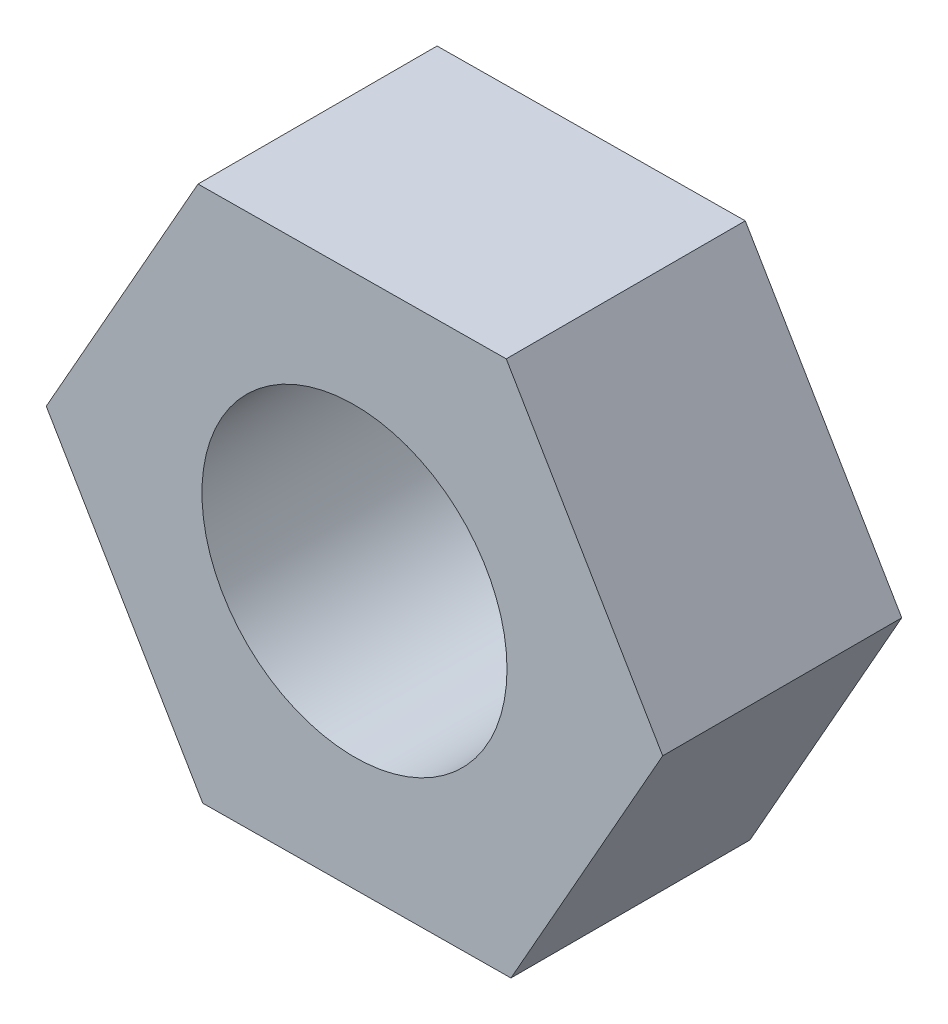
ISO-10303-21;
HEADER;
FILE_DESCRIPTION(('STEP AP214'),'2;1');
FILE_NAME('part.step','',(''),(''),'','','');
FILE_SCHEMA(('AUTOMOTIVE_DESIGN { 1 0 10303 214 1 1 1 1 }'));
ENDSEC;
DATA;
#1=APPLICATION_CONTEXT('core data for automotive mechanical design processes');
#2=APPLICATION_PROTOCOL_DEFINITION('international standard','automotive_design',2000,#1);
#3=PRODUCT_CONTEXT('',#1,'mechanical');
#4=PRODUCT('Part','Part','',(#3));
#5=PRODUCT_RELATED_PRODUCT_CATEGORY('part','',(#4));
#6=PRODUCT_DEFINITION_FORMATION('','',#4);
#7=PRODUCT_DEFINITION_CONTEXT('part definition',#1,'design');
#8=PRODUCT_DEFINITION('design','',#6,#7);
#9=PRODUCT_DEFINITION_SHAPE('','',#8);
#10=(LENGTH_UNIT() NAMED_UNIT(*) SI_UNIT(.MILLI.,.METRE.));
#11=(NAMED_UNIT(*) PLANE_ANGLE_UNIT() SI_UNIT($,.RADIAN.));
#12=(NAMED_UNIT(*) SI_UNIT($,.STERADIAN.) SOLID_ANGLE_UNIT());
#13=UNCERTAINTY_MEASURE_WITH_UNIT(LENGTH_MEASURE(1.E-05),#10,'distance_accuracy_value','');
#14=(GEOMETRIC_REPRESENTATION_CONTEXT(3) GLOBAL_UNCERTAINTY_ASSIGNED_CONTEXT((#13)) GLOBAL_UNIT_ASSIGNED_CONTEXT((#10,
#11,#12)) REPRESENTATION_CONTEXT('',''));
#15=CARTESIAN_POINT('',(0.,0.,0.));
#16=DIRECTION('',(0.,0.,1.));
#17=DIRECTION('',(1.,0.,0.));
#18=AXIS2_PLACEMENT_3D('',#15,#16,#17);
#19=CARTESIAN_POINT('',(0.,0.,3.));
#20=DIRECTION('',(0.,0.,1.));
#21=DIRECTION('',(1.,0.,0.));
#22=AXIS2_PLACEMENT_3D('',#19,#20,#21);
#23=PLANE('',#22);
#24=DIRECTION('',(0.999961257640527,0.00880245522430721,0.));
#25=VECTOR('',#24,1.);
#26=CARTESIAN_POINT('',(-1.90456024427971,-3.36689524773827,3.));
#27=LINE('',#26,#25);
#28=CARTESIAN_POINT('',(-1.90456024427971,-3.36689524773827,3.));
#29=VERTEX_POINT('',#28);
#30=CARTESIAN_POINT('',(1.96353669428258,-3.33284517845327,3.));
#31=VERTEX_POINT('',#30);
#32=EDGE_CURVE('E131',#29,#31,#27,.T.);
#33=ORIENTED_EDGE('',*,*,#32,.T.);
#34=DIRECTION('',(0.492357478980338,0.870393079529086,0.));
#35=VECTOR('',#34,1.);
#36=CARTESIAN_POINT('',(1.96353669428258,-3.33284517845327,3.));
#37=LINE('',#36,#35);
#38=CARTESIAN_POINT('',(3.8680969385623,0.0340500692849943,3.));
#39=VERTEX_POINT('',#38);
#40=EDGE_CURVE('E89',#31,#39,#37,.T.);
#41=ORIENTED_EDGE('',*,*,#40,.T.);
#42=DIRECTION('',(-0.507603778660189,0.861590624304779,0.));
#43=VECTOR('',#42,1.);
#44=CARTESIAN_POINT('',(3.8680969385623,0.0340500692849943,3.));
#45=LINE('',#44,#43);
#46=CARTESIAN_POINT('',(1.90456024427971,3.36689524773827,3.));
#47=VERTEX_POINT('',#46);
#48=EDGE_CURVE('E102',#39,#47,#45,.T.);
#49=ORIENTED_EDGE('',*,*,#48,.T.);
#50=DIRECTION('',(-0.999961257640527,-0.00880245522430722,0.));
#51=VECTOR('',#50,1.);
#52=CARTESIAN_POINT('',(1.90456024427971,3.36689524773827,3.));
#53=LINE('',#52,#51);
#54=CARTESIAN_POINT('',(-1.96353669428257,3.33284517845327,3.));
#55=VERTEX_POINT('',#54);
#56=EDGE_CURVE('E96',#47,#55,#53,.T.);
#57=ORIENTED_EDGE('',*,*,#56,.T.);
#58=DIRECTION('',(-0.492357478980338,-0.870393079529086,0.));
#59=VECTOR('',#58,1.);
#60=CARTESIAN_POINT('',(-1.96353669428257,3.33284517845327,3.));
#61=LINE('',#60,#59);
#62=CARTESIAN_POINT('',(-3.86809693856229,-0.0340500692849975,3.));
#63=VERTEX_POINT('',#62);
#64=EDGE_CURVE('E100',#55,#63,#61,.T.);
#65=ORIENTED_EDGE('',*,*,#64,.T.);
#66=DIRECTION('',(0.507603778660189,-0.861590624304779,0.));
#67=VECTOR('',#66,1.);
#68=CARTESIAN_POINT('',(-3.86809693856229,-0.0340500692849975,3.));
#69=LINE('',#68,#67);
#70=EDGE_CURVE('E52',#63,#29,#69,.T.);
#71=ORIENTED_EDGE('',*,*,#70,.T.);
#72=EDGE_LOOP('',(#33,#41,#49,#57,#65,#71));
#73=FACE_BOUND('',#72,.T.);
#74=CARTESIAN_POINT('',(0.,0.,3.));
#75=DIRECTION('',(0.,0.,1.));
#76=DIRECTION('',(1.,0.,0.));
#77=AXIS2_PLACEMENT_3D('',#74,#75,#76);
#78=CIRCLE('',#77,1.91428571428571);
#79=CARTESIAN_POINT('',(1.91428571428571,0.,3.));
#80=VERTEX_POINT('',#79);
#81=EDGE_CURVE('E124',#80,#80,#78,.T.);
#82=ORIENTED_EDGE('',*,*,#81,.F.);
#83=EDGE_LOOP('',(#82));
#84=FACE_BOUND('',#83,.T.);
#85=ADVANCED_FACE('F35',(#73,#84),#23,.T.);
#86=CARTESIAN_POINT('',(0.,0.,0.));
#87=DIRECTION('',(0.,0.,1.));
#88=DIRECTION('',(1.,0.,0.));
#89=AXIS2_PLACEMENT_3D('',#86,#87,#88);
#90=PLANE('',#89);
#91=DIRECTION('',(0.999961257640527,0.00880245522430721,0.));
#92=VECTOR('',#91,1.);
#93=CARTESIAN_POINT('',(-1.90456024427971,-3.36689524773827,0.));
#94=LINE('',#93,#92);
#95=CARTESIAN_POINT('',(-1.90456024427971,-3.36689524773827,0.));
#96=VERTEX_POINT('',#95);
#97=CARTESIAN_POINT('',(1.96353669428258,-3.33284517845327,0.));
#98=VERTEX_POINT('',#97);
#99=EDGE_CURVE('E120',#96,#98,#94,.T.);
#100=ORIENTED_EDGE('',*,*,#99,.F.);
#101=DIRECTION('',(0.507603778660189,-0.861590624304779,0.));
#102=VECTOR('',#101,1.);
#103=CARTESIAN_POINT('',(-3.86809693856229,-0.0340500692849975,0.));
#104=LINE('',#103,#102);
#105=CARTESIAN_POINT('',(-3.86809693856229,-0.0340500692849975,0.));
#106=VERTEX_POINT('',#105);
#107=EDGE_CURVE('E81',#106,#96,#104,.T.);
#108=ORIENTED_EDGE('',*,*,#107,.F.);
#109=DIRECTION('',(-0.492357478980338,-0.870393079529086,0.));
#110=VECTOR('',#109,1.);
#111=CARTESIAN_POINT('',(-1.96353669428257,3.33284517845327,0.));
#112=LINE('',#111,#110);
#113=CARTESIAN_POINT('',(-1.96353669428257,3.33284517845327,0.));
#114=VERTEX_POINT('',#113);
#115=EDGE_CURVE('E75',#114,#106,#112,.T.);
#116=ORIENTED_EDGE('',*,*,#115,.F.);
#117=DIRECTION('',(-0.999961257640527,-0.00880245522430722,0.));
#118=VECTOR('',#117,1.);
#119=CARTESIAN_POINT('',(1.90456024427971,3.36689524773827,0.));
#120=LINE('',#119,#118);
#121=CARTESIAN_POINT('',(1.90456024427971,3.36689524773827,0.));
#122=VERTEX_POINT('',#121);
#123=EDGE_CURVE('E110',#122,#114,#120,.T.);
#124=ORIENTED_EDGE('',*,*,#123,.F.);
#125=DIRECTION('',(-0.507603778660189,0.861590624304779,0.));
#126=VECTOR('',#125,1.);
#127=CARTESIAN_POINT('',(3.8680969385623,0.0340500692849943,0.));
#128=LINE('',#127,#126);
#129=CARTESIAN_POINT('',(3.8680969385623,0.0340500692849943,0.));
#130=VERTEX_POINT('',#129);
#131=EDGE_CURVE('E126',#130,#122,#128,.T.);
#132=ORIENTED_EDGE('',*,*,#131,.F.);
#133=DIRECTION('',(0.492357478980338,0.870393079529086,0.));
#134=VECTOR('',#133,1.);
#135=CARTESIAN_POINT('',(1.96353669428258,-3.33284517845327,0.));
#136=LINE('',#135,#134);
#137=EDGE_CURVE('E123',#98,#130,#136,.T.);
#138=ORIENTED_EDGE('',*,*,#137,.F.);
#139=EDGE_LOOP('',(#100,#108,#116,#124,#132,#138));
#140=FACE_BOUND('',#139,.T.);
#141=CARTESIAN_POINT('',(0.,0.,0.));
#142=DIRECTION('',(0.,0.,1.));
#143=DIRECTION('',(1.,0.,0.));
#144=AXIS2_PLACEMENT_3D('',#141,#142,#143);
#145=CIRCLE('',#144,1.91428571428571);
#146=CARTESIAN_POINT('',(1.91428571428571,0.,0.));
#147=VERTEX_POINT('',#146);
#148=EDGE_CURVE('E224',#147,#147,#145,.T.);
#149=ORIENTED_EDGE('',*,*,#148,.T.);
#150=EDGE_LOOP('',(#149));
#151=FACE_BOUND('',#150,.T.);
#152=ADVANCED_FACE('F140',(#140,#151),#90,.F.);
#153=CARTESIAN_POINT('',(-1.90456024427971,-3.36689524773827,3.));
#154=DIRECTION('',(-0.00880245522430721,0.999961257640527,0.));
#155=DIRECTION('',(-0.999961257640527,-0.00880245522430721,0.));
#156=AXIS2_PLACEMENT_3D('',#153,#154,#155);
#157=PLANE('',#156);
#158=ORIENTED_EDGE('',*,*,#99,.T.);
#159=DIRECTION('',(0.,0.,-1.));
#160=VECTOR('',#159,1.);
#161=CARTESIAN_POINT('',(1.96353669428258,-3.33284517845327,3.));
#162=LINE('',#161,#160);
#163=EDGE_CURVE('E11',#31,#98,#162,.T.);
#164=ORIENTED_EDGE('',*,*,#163,.F.);
#165=ORIENTED_EDGE('',*,*,#32,.F.);
#166=DIRECTION('',(0.,0.,-1.));
#167=VECTOR('',#166,1.);
#168=CARTESIAN_POINT('',(-1.90456024427971,-3.36689524773827,3.));
#169=LINE('',#168,#167);
#170=EDGE_CURVE('E116',#29,#96,#169,.T.);
#171=ORIENTED_EDGE('',*,*,#170,.T.);
#172=EDGE_LOOP('',(#158,#164,#165,#171));
#173=FACE_BOUND('',#172,.T.);
#174=ADVANCED_FACE('F37',(#173),#157,.F.);
#175=CARTESIAN_POINT('',(1.96353669428258,-3.33284517845327,3.));
#176=DIRECTION('',(-0.870393079529086,0.492357478980338,0.));
#177=DIRECTION('',(-0.492357478980338,-0.870393079529086,0.));
#178=AXIS2_PLACEMENT_3D('',#175,#176,#177);
#179=PLANE('',#178);
#180=ORIENTED_EDGE('',*,*,#137,.T.);
#181=DIRECTION('',(0.,0.,-1.));
#182=VECTOR('',#181,1.);
#183=CARTESIAN_POINT('',(3.8680969385623,0.0340500692849943,3.));
#184=LINE('',#183,#182);
#185=EDGE_CURVE('E44',#39,#130,#184,.T.);
#186=ORIENTED_EDGE('',*,*,#185,.F.);
#187=ORIENTED_EDGE('',*,*,#40,.F.);
#188=ORIENTED_EDGE('',*,*,#163,.T.);
#189=EDGE_LOOP('',(#180,#186,#187,#188));
#190=FACE_BOUND('',#189,.T.);
#191=ADVANCED_FACE('F165',(#190),#179,.F.);
#192=CARTESIAN_POINT('',(3.8680969385623,0.0340500692849943,3.));
#193=DIRECTION('',(-0.861590624304779,-0.507603778660189,0.));
#194=DIRECTION('',(0.507603778660189,-0.861590624304779,0.));
#195=AXIS2_PLACEMENT_3D('',#192,#193,#194);
#196=PLANE('',#195);
#197=ORIENTED_EDGE('',*,*,#131,.T.);
#198=DIRECTION('',(0.,0.,-1.));
#199=VECTOR('',#198,1.);
#200=CARTESIAN_POINT('',(1.90456024427971,3.36689524773827,3.));
#201=LINE('',#200,#199);
#202=EDGE_CURVE('E111',#47,#122,#201,.T.);
#203=ORIENTED_EDGE('',*,*,#202,.F.);
#204=ORIENTED_EDGE('',*,*,#48,.F.);
#205=ORIENTED_EDGE('',*,*,#185,.T.);
#206=EDGE_LOOP('',(#197,#203,#204,#205));
#207=FACE_BOUND('',#206,.T.);
#208=ADVANCED_FACE('F137',(#207),#196,.F.);
#209=CARTESIAN_POINT('',(1.90456024427971,3.36689524773827,3.));
#210=DIRECTION('',(0.00880245522430722,-0.999961257640527,0.));
#211=DIRECTION('',(0.999961257640527,0.00880245522430722,0.));
#212=AXIS2_PLACEMENT_3D('',#209,#210,#211);
#213=PLANE('',#212);
#214=ORIENTED_EDGE('',*,*,#123,.T.);
#215=DIRECTION('',(0.,0.,-1.));
#216=VECTOR('',#215,1.);
#217=CARTESIAN_POINT('',(-1.96353669428257,3.33284517845327,3.));
#218=LINE('',#217,#216);
#219=EDGE_CURVE('E107',#55,#114,#218,.T.);
#220=ORIENTED_EDGE('',*,*,#219,.F.);
#221=ORIENTED_EDGE('',*,*,#56,.F.);
#222=ORIENTED_EDGE('',*,*,#202,.T.);
#223=EDGE_LOOP('',(#214,#220,#221,#222));
#224=FACE_BOUND('',#223,.T.);
#225=ADVANCED_FACE('F108',(#224),#213,.F.);
#226=CARTESIAN_POINT('',(-1.96353669428257,3.33284517845327,3.));
#227=DIRECTION('',(0.870393079529086,-0.492357478980338,0.));
#228=DIRECTION('',(0.492357478980338,0.870393079529086,0.));
#229=AXIS2_PLACEMENT_3D('',#226,#227,#228);
#230=PLANE('',#229);
#231=ORIENTED_EDGE('',*,*,#115,.T.);
#232=DIRECTION('',(0.,0.,-1.));
#233=VECTOR('',#232,1.);
#234=CARTESIAN_POINT('',(-3.86809693856229,-0.0340500692849975,3.));
#235=LINE('',#234,#233);
#236=EDGE_CURVE('E112',#63,#106,#235,.T.);
#237=ORIENTED_EDGE('',*,*,#236,.F.);
#238=ORIENTED_EDGE('',*,*,#64,.F.);
#239=ORIENTED_EDGE('',*,*,#219,.T.);
#240=EDGE_LOOP('',(#231,#237,#238,#239));
#241=FACE_BOUND('',#240,.T.);
#242=ADVANCED_FACE('F114',(#241),#230,.F.);
#243=CARTESIAN_POINT('',(-3.86809693856229,-0.0340500692849975,3.));
#244=DIRECTION('',(0.861590624304779,0.507603778660189,0.));
#245=DIRECTION('',(-0.507603778660189,0.861590624304779,0.));
#246=AXIS2_PLACEMENT_3D('',#243,#244,#245);
#247=PLANE('',#246);
#248=ORIENTED_EDGE('',*,*,#107,.T.);
#249=ORIENTED_EDGE('',*,*,#170,.F.);
#250=ORIENTED_EDGE('',*,*,#70,.F.);
#251=ORIENTED_EDGE('',*,*,#236,.T.);
#252=EDGE_LOOP('',(#248,#249,#250,#251));
#253=FACE_BOUND('',#252,.T.);
#254=ADVANCED_FACE('F145',(#253),#247,.F.);
#255=CARTESIAN_POINT('',(0.,0.,3.));
#256=DIRECTION('',(0.,0.,-1.));
#257=DIRECTION('',(-1.,0.,0.));
#258=AXIS2_PLACEMENT_3D('',#255,#256,#257);
#259=CYLINDRICAL_SURFACE('',#258,1.91428571428571);
#260=ORIENTED_EDGE('',*,*,#81,.T.);
#261=EDGE_LOOP('',(#260));
#262=FACE_BOUND('',#261,.T.);
#263=ORIENTED_EDGE('',*,*,#148,.F.);
#264=EDGE_LOOP('',(#263));
#265=FACE_BOUND('',#264,.T.);
#266=ADVANCED_FACE('F147',(#262,#265),#259,.F.);
#267=CLOSED_SHELL('',(#85,#152,#174,#191,#208,#225,#242,#254,#266));
#268=MANIFOLD_SOLID_BREP('B2',#267);
#269=ADVANCED_BREP_SHAPE_REPRESENTATION('',(#18,#268),#14);
#270=SHAPE_DEFINITION_REPRESENTATION(#9,#269);
ENDSEC;
END-ISO-10303-21;
